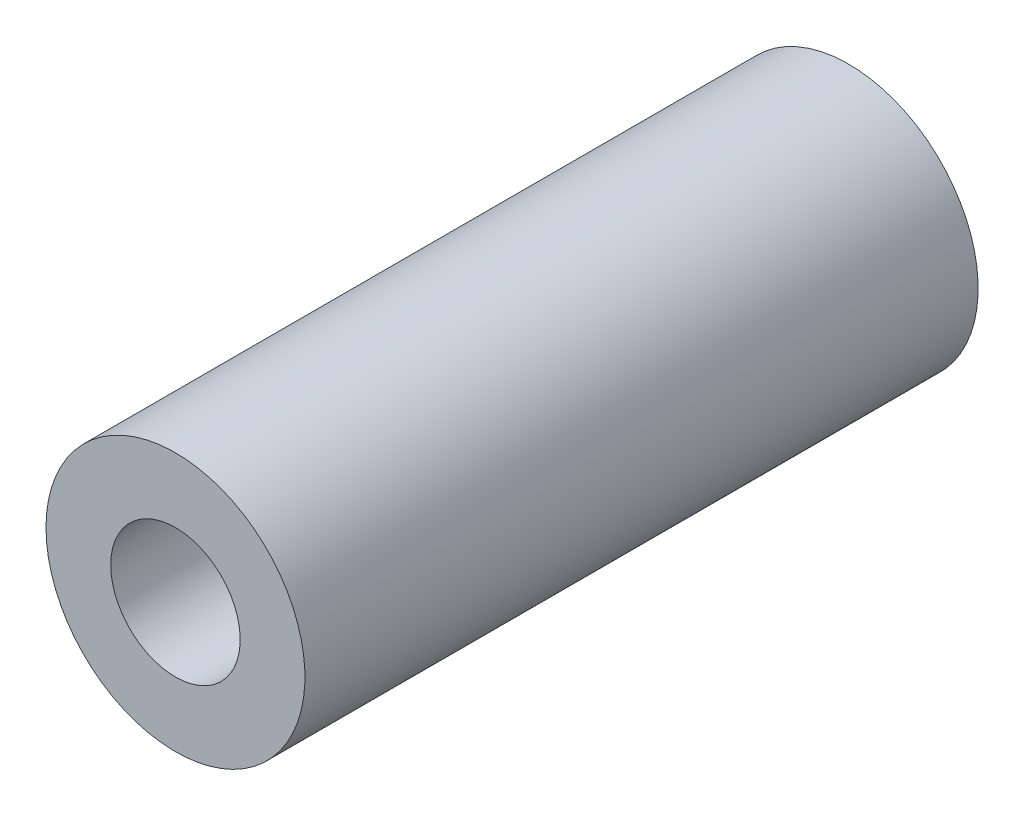
ISO-10303-21;
HEADER;
FILE_DESCRIPTION(('STEP AP214'),'2;1');
FILE_NAME('part.step','',(''),(''),'','','');
FILE_SCHEMA(('AUTOMOTIVE_DESIGN { 1 0 10303 214 1 1 1 1 }'));
ENDSEC;
DATA;
#1=APPLICATION_CONTEXT('core data for automotive mechanical design processes');
#2=APPLICATION_PROTOCOL_DEFINITION('international standard','automotive_design',2000,#1);
#3=PRODUCT_CONTEXT('',#1,'mechanical');
#4=PRODUCT('Part','Part','',(#3));
#5=PRODUCT_RELATED_PRODUCT_CATEGORY('part','',(#4));
#6=PRODUCT_DEFINITION_FORMATION('','',#4);
#7=PRODUCT_DEFINITION_CONTEXT('part definition',#1,'design');
#8=PRODUCT_DEFINITION('design','',#6,#7);
#9=PRODUCT_DEFINITION_SHAPE('','',#8);
#10=(LENGTH_UNIT() NAMED_UNIT(*) SI_UNIT(.MILLI.,.METRE.));
#11=(NAMED_UNIT(*) PLANE_ANGLE_UNIT() SI_UNIT($,.RADIAN.));
#12=(NAMED_UNIT(*) SI_UNIT($,.STERADIAN.) SOLID_ANGLE_UNIT());
#13=UNCERTAINTY_MEASURE_WITH_UNIT(LENGTH_MEASURE(1.E-05),#10,'distance_accuracy_value','');
#14=(GEOMETRIC_REPRESENTATION_CONTEXT(3) GLOBAL_UNCERTAINTY_ASSIGNED_CONTEXT((#13)) GLOBAL_UNIT_ASSIGNED_CONTEXT((#10,
#11,#12)) REPRESENTATION_CONTEXT('',''));
#15=CARTESIAN_POINT('',(0.,0.,0.));
#16=DIRECTION('',(0.,0.,1.));
#17=DIRECTION('',(1.,0.,0.));
#18=AXIS2_PLACEMENT_3D('',#15,#16,#17);
#19=CARTESIAN_POINT('',(0.,0.,26.));
#20=DIRECTION('',(0.,0.,1.));
#21=DIRECTION('',(1.,0.,0.));
#22=AXIS2_PLACEMENT_3D('',#19,#20,#21);
#23=PLANE('',#22);
#24=CARTESIAN_POINT('',(0.,0.,26.));
#25=DIRECTION('',(0.,0.,1.));
#26=DIRECTION('',(1.,0.,0.));
#27=AXIS2_PLACEMENT_3D('',#24,#25,#26);
#28=CIRCLE('',#27,5.);
#29=CARTESIAN_POINT('',(-5.,0.,26.));
#30=VERTEX_POINT('',#29);
#31=EDGE_CURVE('E10',#30,#30,#28,.T.);
#32=ORIENTED_EDGE('',*,*,#31,.T.);
#33=EDGE_LOOP('',(#32));
#34=FACE_BOUND('',#33,.T.);
#35=CARTESIAN_POINT('',(0.,0.,26.));
#36=DIRECTION('',(0.,0.,1.));
#37=DIRECTION('',(1.,0.,0.));
#38=AXIS2_PLACEMENT_3D('',#35,#36,#37);
#39=CIRCLE('',#38,2.5);
#40=CARTESIAN_POINT('',(-2.5,0.,26.));
#41=VERTEX_POINT('',#40);
#42=EDGE_CURVE('E43',#41,#41,#39,.T.);
#43=ORIENTED_EDGE('',*,*,#42,.F.);
#44=EDGE_LOOP('',(#43));
#45=FACE_BOUND('',#44,.T.);
#46=ADVANCED_FACE('F32',(#34,#45),#23,.T.);
#47=CARTESIAN_POINT('',(0.,0.,0.));
#48=DIRECTION('',(0.,0.,1.));
#49=DIRECTION('',(1.,0.,0.));
#50=AXIS2_PLACEMENT_3D('',#47,#48,#49);
#51=PLANE('',#50);
#52=CARTESIAN_POINT('',(0.,0.,0.));
#53=DIRECTION('',(0.,0.,1.));
#54=DIRECTION('',(1.,0.,0.));
#55=AXIS2_PLACEMENT_3D('',#52,#53,#54);
#56=CIRCLE('',#55,5.);
#57=CARTESIAN_POINT('',(-5.,0.,0.));
#58=VERTEX_POINT('',#57);
#59=EDGE_CURVE('E36',#58,#58,#56,.T.);
#60=ORIENTED_EDGE('',*,*,#59,.F.);
#61=EDGE_LOOP('',(#60));
#62=FACE_BOUND('',#61,.T.);
#63=CARTESIAN_POINT('',(0.,0.,0.));
#64=DIRECTION('',(0.,0.,1.));
#65=DIRECTION('',(1.,0.,0.));
#66=AXIS2_PLACEMENT_3D('',#63,#64,#65);
#67=CIRCLE('',#66,2.5);
#68=CARTESIAN_POINT('',(-2.5,0.,0.));
#69=VERTEX_POINT('',#68);
#70=EDGE_CURVE('E45',#69,#69,#67,.T.);
#71=ORIENTED_EDGE('',*,*,#70,.T.);
#72=EDGE_LOOP('',(#71));
#73=FACE_BOUND('',#72,.T.);
#74=ADVANCED_FACE('F55',(#62,#73),#51,.F.);
#75=CARTESIAN_POINT('',(0.,0.,26.));
#76=DIRECTION('',(0.,0.,-1.));
#77=DIRECTION('',(-1.,0.,0.));
#78=AXIS2_PLACEMENT_3D('',#75,#76,#77);
#79=CYLINDRICAL_SURFACE('',#78,5.);
#80=CARTESIAN_POINT('',(-5.,0.,26.));
#81=CARTESIAN_POINT('',(-5.,0.,25.7291666666667));
#82=CARTESIAN_POINT('',(-5.,0.,25.4583333333333));
#83=CARTESIAN_POINT('',(-5.,0.,24.9166666666667));
#84=CARTESIAN_POINT('',(-5.,0.,24.6458333333333));
#85=CARTESIAN_POINT('',(-5.,0.,24.1041666666667));
#86=CARTESIAN_POINT('',(-5.,0.,23.8333333333333));
#87=CARTESIAN_POINT('',(-5.,0.,23.2916666666667));
#88=CARTESIAN_POINT('',(-5.,0.,23.0208333333333));
#89=CARTESIAN_POINT('',(-5.,0.,22.4791666666667));
#90=CARTESIAN_POINT('',(-5.,0.,22.2083333333333));
#91=CARTESIAN_POINT('',(-5.,0.,21.6666666666667));
#92=CARTESIAN_POINT('',(-5.,0.,21.3958333333333));
#93=CARTESIAN_POINT('',(-5.,0.,20.8541666666667));
#94=CARTESIAN_POINT('',(-5.,0.,20.5833333333333));
#95=CARTESIAN_POINT('',(-5.,0.,20.0416666666667));
#96=CARTESIAN_POINT('',(-5.,0.,19.7708333333333));
#97=CARTESIAN_POINT('',(-5.,0.,19.2291666666667));
#98=CARTESIAN_POINT('',(-5.,0.,18.9583333333333));
#99=CARTESIAN_POINT('',(-5.,0.,18.4166666666667));
#100=CARTESIAN_POINT('',(-5.,0.,18.1458333333333));
#101=CARTESIAN_POINT('',(-5.,0.,17.6041666666667));
#102=CARTESIAN_POINT('',(-5.,0.,17.3333333333333));
#103=CARTESIAN_POINT('',(-5.,0.,16.7916666666667));
#104=CARTESIAN_POINT('',(-5.,0.,16.5208333333333));
#105=CARTESIAN_POINT('',(-5.,0.,15.9791666666667));
#106=CARTESIAN_POINT('',(-5.,0.,15.7083333333333));
#107=CARTESIAN_POINT('',(-5.,0.,15.1666666666667));
#108=CARTESIAN_POINT('',(-5.,0.,14.8958333333333));
#109=CARTESIAN_POINT('',(-5.,0.,14.3541666666667));
#110=CARTESIAN_POINT('',(-5.,0.,14.0833333333333));
#111=CARTESIAN_POINT('',(-5.,0.,13.5416666666667));
#112=CARTESIAN_POINT('',(-5.,0.,13.2708333333333));
#113=CARTESIAN_POINT('',(-5.,0.,12.7291666666667));
#114=CARTESIAN_POINT('',(-5.,0.,12.4583333333333));
#115=CARTESIAN_POINT('',(-5.,0.,11.9166666666667));
#116=CARTESIAN_POINT('',(-5.,0.,11.6458333333333));
#117=CARTESIAN_POINT('',(-5.,0.,11.1041666666667));
#118=CARTESIAN_POINT('',(-5.,0.,10.8333333333333));
#119=CARTESIAN_POINT('',(-5.,0.,10.2916666666667));
#120=CARTESIAN_POINT('',(-5.,0.,10.0208333333333));
#121=CARTESIAN_POINT('',(-5.,0.,9.47916666666667));
#122=CARTESIAN_POINT('',(-5.,0.,9.20833333333333));
#123=CARTESIAN_POINT('',(-5.,0.,8.66666666666667));
#124=CARTESIAN_POINT('',(-5.,0.,8.39583333333333));
#125=CARTESIAN_POINT('',(-5.,0.,7.85416666666667));
#126=CARTESIAN_POINT('',(-5.,0.,7.58333333333333));
#127=CARTESIAN_POINT('',(-5.,0.,7.04166666666667));
#128=CARTESIAN_POINT('',(-5.,0.,6.77083333333333));
#129=CARTESIAN_POINT('',(-5.,0.,6.22916666666667));
#130=CARTESIAN_POINT('',(-5.,0.,5.95833333333333));
#131=CARTESIAN_POINT('',(-5.,0.,5.41666666666667));
#132=CARTESIAN_POINT('',(-5.,0.,5.14583333333333));
#133=CARTESIAN_POINT('',(-5.,0.,4.60416666666667));
#134=CARTESIAN_POINT('',(-5.,0.,4.33333333333333));
#135=CARTESIAN_POINT('',(-5.,0.,3.79166666666667));
#136=CARTESIAN_POINT('',(-5.,0.,3.52083333333333));
#137=CARTESIAN_POINT('',(-5.,0.,2.97916666666667));
#138=CARTESIAN_POINT('',(-5.,0.,2.70833333333333));
#139=CARTESIAN_POINT('',(-5.,0.,2.16666666666667));
#140=CARTESIAN_POINT('',(-5.,0.,1.89583333333333));
#141=CARTESIAN_POINT('',(-5.,0.,1.35416666666667));
#142=CARTESIAN_POINT('',(-5.,0.,1.08333333333333));
#143=CARTESIAN_POINT('',(-5.,0.,0.541666666666667));
#144=CARTESIAN_POINT('',(-5.,0.,0.270833333333334));
#145=CARTESIAN_POINT('',(-5.,0.,0.));
#146=B_SPLINE_CURVE_WITH_KNOTS('',3,(#80,#81,#82,#83,#84,#85,#86,#87,#88,#89,#90,#91,#92,#93,
#94,#95,#96,#97,#98,#99,#100,#101,#102,#103,#104,#105,#106,#107,#108,#109,#110,#111,#112,#113,
#114,#115,#116,#117,#118,#119,#120,#121,#122,#123,#124,#125,#126,#127,#128,#129,#130,#131,#132,
#133,#134,#135,#136,#137,#138,#139,#140,#141,#142,#143,#144,#145),.UNSPECIFIED.,.F.,.F.,(4,2,2,
2,2,2,2,2,2,2,2,2,2,2,2,2,2,2,2,2,2,2,2,2,2,2,2,2,2,2,2,2,4),(0.,0.812499999999997,1.625,2.4375,
3.25,4.0625,4.875,5.6875,6.5,7.3125,8.125,8.93749999999999,9.74999999999999,10.5625,11.375,
12.1875,13.,13.8125,14.625,15.4375,16.25,17.0625,17.875,18.6875,19.5,20.3125,21.125,21.9375,
22.75,23.5625,24.375,25.1875,26.),.UNSPECIFIED.);
#147=EDGE_CURVE('BSEAM34',#30,#58,#146,.T.);
#148=ORIENTED_EDGE('',*,*,#31,.F.);
#149=ORIENTED_EDGE('',*,*,#59,.T.);
#150=ORIENTED_EDGE('',*,*,#147,.T.);
#151=ORIENTED_EDGE('',*,*,#147,.F.);
#152=EDGE_LOOP('',(#148,#150,#149,#151));
#153=FACE_BOUND('',#152,.T.);
#154=ADVANCED_FACE('F34',(#153),#79,.T.);
#155=CARTESIAN_POINT('',(0.,0.,26.));
#156=DIRECTION('',(0.,0.,-1.));
#157=DIRECTION('',(-1.,0.,0.));
#158=AXIS2_PLACEMENT_3D('',#155,#156,#157);
#159=CYLINDRICAL_SURFACE('',#158,2.5);
#160=CARTESIAN_POINT('',(-2.5,0.,26.));
#161=CARTESIAN_POINT('',(-2.5,0.,25.7291666666667));
#162=CARTESIAN_POINT('',(-2.5,0.,25.4583333333333));
#163=CARTESIAN_POINT('',(-2.5,0.,24.9166666666667));
#164=CARTESIAN_POINT('',(-2.5,0.,24.6458333333333));
#165=CARTESIAN_POINT('',(-2.5,0.,24.1041666666667));
#166=CARTESIAN_POINT('',(-2.5,0.,23.8333333333333));
#167=CARTESIAN_POINT('',(-2.5,0.,23.2916666666667));
#168=CARTESIAN_POINT('',(-2.5,0.,23.0208333333333));
#169=CARTESIAN_POINT('',(-2.5,0.,22.4791666666667));
#170=CARTESIAN_POINT('',(-2.5,0.,22.2083333333333));
#171=CARTESIAN_POINT('',(-2.5,0.,21.6666666666667));
#172=CARTESIAN_POINT('',(-2.5,0.,21.3958333333333));
#173=CARTESIAN_POINT('',(-2.5,0.,20.8541666666667));
#174=CARTESIAN_POINT('',(-2.5,0.,20.5833333333333));
#175=CARTESIAN_POINT('',(-2.5,0.,20.0416666666667));
#176=CARTESIAN_POINT('',(-2.5,0.,19.7708333333333));
#177=CARTESIAN_POINT('',(-2.5,0.,19.2291666666667));
#178=CARTESIAN_POINT('',(-2.5,0.,18.9583333333333));
#179=CARTESIAN_POINT('',(-2.5,0.,18.4166666666667));
#180=CARTESIAN_POINT('',(-2.5,0.,18.1458333333333));
#181=CARTESIAN_POINT('',(-2.5,0.,17.6041666666667));
#182=CARTESIAN_POINT('',(-2.5,0.,17.3333333333333));
#183=CARTESIAN_POINT('',(-2.5,0.,16.7916666666667));
#184=CARTESIAN_POINT('',(-2.5,0.,16.5208333333333));
#185=CARTESIAN_POINT('',(-2.5,0.,15.9791666666667));
#186=CARTESIAN_POINT('',(-2.5,0.,15.7083333333333));
#187=CARTESIAN_POINT('',(-2.5,0.,15.1666666666667));
#188=CARTESIAN_POINT('',(-2.5,0.,14.8958333333333));
#189=CARTESIAN_POINT('',(-2.5,0.,14.3541666666667));
#190=CARTESIAN_POINT('',(-2.5,0.,14.0833333333333));
#191=CARTESIAN_POINT('',(-2.5,0.,13.5416666666667));
#192=CARTESIAN_POINT('',(-2.5,0.,13.2708333333333));
#193=CARTESIAN_POINT('',(-2.5,0.,12.7291666666667));
#194=CARTESIAN_POINT('',(-2.5,0.,12.4583333333333));
#195=CARTESIAN_POINT('',(-2.5,0.,11.9166666666667));
#196=CARTESIAN_POINT('',(-2.5,0.,11.6458333333333));
#197=CARTESIAN_POINT('',(-2.5,0.,11.1041666666667));
#198=CARTESIAN_POINT('',(-2.5,0.,10.8333333333333));
#199=CARTESIAN_POINT('',(-2.5,0.,10.2916666666667));
#200=CARTESIAN_POINT('',(-2.5,0.,10.0208333333333));
#201=CARTESIAN_POINT('',(-2.5,0.,9.47916666666667));
#202=CARTESIAN_POINT('',(-2.5,0.,9.20833333333333));
#203=CARTESIAN_POINT('',(-2.5,0.,8.66666666666667));
#204=CARTESIAN_POINT('',(-2.5,0.,8.39583333333333));
#205=CARTESIAN_POINT('',(-2.5,0.,7.85416666666667));
#206=CARTESIAN_POINT('',(-2.5,0.,7.58333333333333));
#207=CARTESIAN_POINT('',(-2.5,0.,7.04166666666667));
#208=CARTESIAN_POINT('',(-2.5,0.,6.77083333333333));
#209=CARTESIAN_POINT('',(-2.5,0.,6.22916666666667));
#210=CARTESIAN_POINT('',(-2.5,0.,5.95833333333333));
#211=CARTESIAN_POINT('',(-2.5,0.,5.41666666666667));
#212=CARTESIAN_POINT('',(-2.5,0.,5.14583333333333));
#213=CARTESIAN_POINT('',(-2.5,0.,4.60416666666667));
#214=CARTESIAN_POINT('',(-2.5,0.,4.33333333333333));
#215=CARTESIAN_POINT('',(-2.5,0.,3.79166666666667));
#216=CARTESIAN_POINT('',(-2.5,0.,3.52083333333333));
#217=CARTESIAN_POINT('',(-2.5,0.,2.97916666666667));
#218=CARTESIAN_POINT('',(-2.5,0.,2.70833333333333));
#219=CARTESIAN_POINT('',(-2.5,0.,2.16666666666667));
#220=CARTESIAN_POINT('',(-2.5,0.,1.89583333333333));
#221=CARTESIAN_POINT('',(-2.5,0.,1.35416666666667));
#222=CARTESIAN_POINT('',(-2.5,0.,1.08333333333333));
#223=CARTESIAN_POINT('',(-2.5,0.,0.541666666666667));
#224=CARTESIAN_POINT('',(-2.5,0.,0.270833333333334));
#225=CARTESIAN_POINT('',(-2.5,0.,0.));
#226=B_SPLINE_CURVE_WITH_KNOTS('',3,(#160,#161,#162,#163,#164,#165,#166,#167,#168,#169,#170,
#171,#172,#173,#174,#175,#176,#177,#178,#179,#180,#181,#182,#183,#184,#185,#186,#187,#188,#189,
#190,#191,#192,#193,#194,#195,#196,#197,#198,#199,#200,#201,#202,#203,#204,#205,#206,#207,#208,
#209,#210,#211,#212,#213,#214,#215,#216,#217,#218,#219,#220,#221,#222,#223,#224,#225),
.UNSPECIFIED.,.F.,.F.,(4,2,2,2,2,2,2,2,2,2,2,2,2,2,2,2,2,2,2,2,2,2,2,2,2,2,2,2,2,2,2,2,4),(0.,
0.812500000000001,1.625,2.4375,3.25,4.0625,4.875,5.6875,6.5,7.3125,8.125,8.9375,9.75,10.5625,
11.375,12.1875,13.,13.8125,14.625,15.4375,16.25,17.0625,17.875,18.6875,19.5,20.3125,21.125,
21.9375,22.75,23.5625,24.375,25.1875,26.),.UNSPECIFIED.);
#227=EDGE_CURVE('BSEAM51',#41,#69,#226,.T.);
#228=ORIENTED_EDGE('',*,*,#42,.T.);
#229=ORIENTED_EDGE('',*,*,#70,.F.);
#230=ORIENTED_EDGE('',*,*,#227,.T.);
#231=ORIENTED_EDGE('',*,*,#227,.F.);
#232=EDGE_LOOP('',(#228,#230,#229,#231));
#233=FACE_BOUND('',#232,.T.);
#234=ADVANCED_FACE('F51',(#233),#159,.F.);
#235=CLOSED_SHELL('',(#46,#74,#154,#234));
#236=MANIFOLD_SOLID_BREP('B2',#235);
#237=ADVANCED_BREP_SHAPE_REPRESENTATION('',(#18,#236),#14);
#238=SHAPE_DEFINITION_REPRESENTATION(#9,#237);
ENDSEC;
END-ISO-10303-21;
